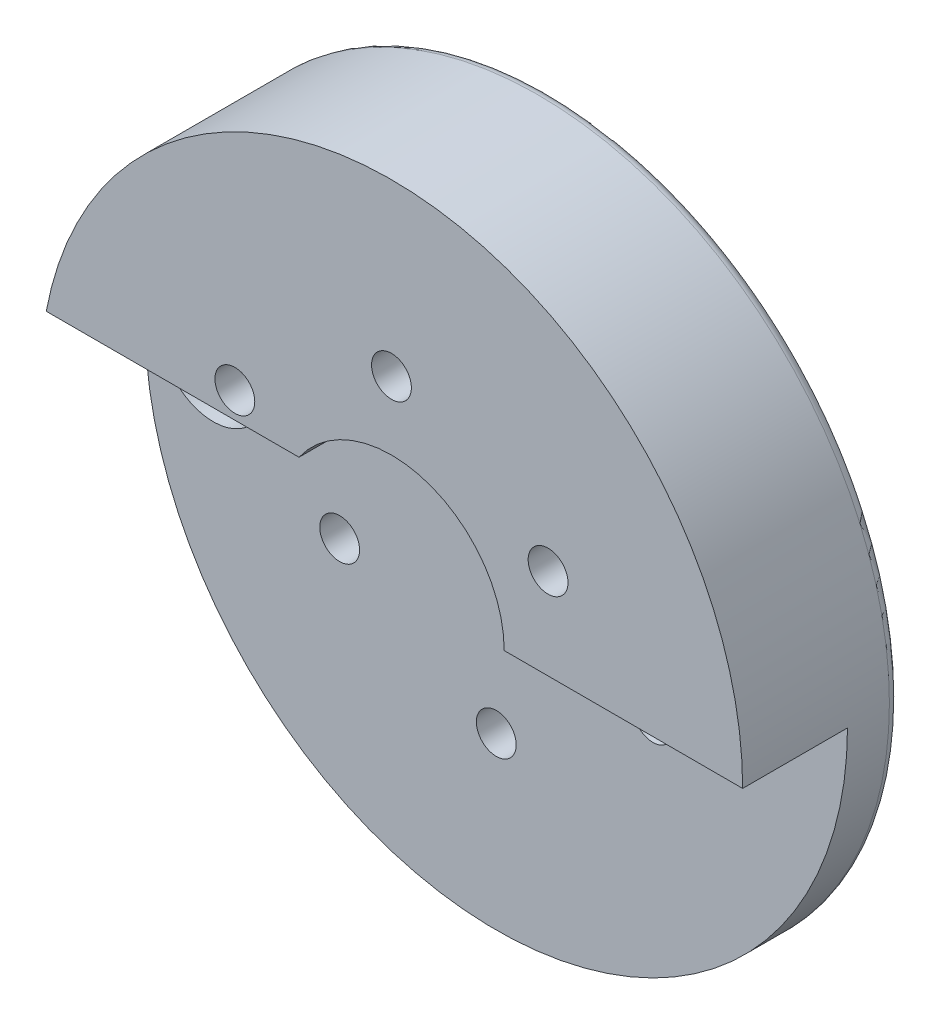
ISO-10303-21;
HEADER;
FILE_DESCRIPTION(('STEP AP214'),'2;1');
FILE_NAME('part.step','',(''),(''),'','','');
FILE_SCHEMA(('AUTOMOTIVE_DESIGN { 1 0 10303 214 1 1 1 1 }'));
ENDSEC;
DATA;
#1=APPLICATION_CONTEXT('core data for automotive mechanical design processes');
#2=APPLICATION_PROTOCOL_DEFINITION('international standard','automotive_design',2000,#1);
#3=PRODUCT_CONTEXT('',#1,'mechanical');
#4=PRODUCT('Part','Part','',(#3));
#5=PRODUCT_RELATED_PRODUCT_CATEGORY('part','',(#4));
#6=PRODUCT_DEFINITION_FORMATION('','',#4);
#7=PRODUCT_DEFINITION_CONTEXT('part definition',#1,'design');
#8=PRODUCT_DEFINITION('design','',#6,#7);
#9=PRODUCT_DEFINITION_SHAPE('','',#8);
#10=(LENGTH_UNIT() NAMED_UNIT(*) SI_UNIT(.MILLI.,.METRE.));
#11=(NAMED_UNIT(*) PLANE_ANGLE_UNIT() SI_UNIT($,.RADIAN.));
#12=(NAMED_UNIT(*) SI_UNIT($,.STERADIAN.) SOLID_ANGLE_UNIT());
#13=UNCERTAINTY_MEASURE_WITH_UNIT(LENGTH_MEASURE(1.E-05),#10,'distance_accuracy_value','');
#14=(GEOMETRIC_REPRESENTATION_CONTEXT(3) GLOBAL_UNCERTAINTY_ASSIGNED_CONTEXT((#13)) GLOBAL_UNIT_ASSIGNED_CONTEXT((#10,
#11,#12)) REPRESENTATION_CONTEXT('',''));
#15=CARTESIAN_POINT('',(0.,0.,0.));
#16=DIRECTION('',(0.,0.,1.));
#17=DIRECTION('',(1.,0.,0.));
#18=AXIS2_PLACEMENT_3D('',#15,#16,#17);
#19=CARTESIAN_POINT('',(14.9389382152816,8.625,-18.));
#20=DIRECTION('',(0.,0.,1.));
#21=DIRECTION('',(-1.,0.,0.));
#22=AXIS2_PLACEMENT_3D('',#19,#20,#21);
#23=CYLINDRICAL_SURFACE('',#22,1.9);
#24=CARTESIAN_POINT('',(14.9389382152816,8.625,0.));
#25=DIRECTION('',(0.,0.,1.));
#26=DIRECTION('',(1.,0.,0.));
#27=AXIS2_PLACEMENT_3D('',#24,#25,#26);
#28=CIRCLE('',#27,1.9);
#29=CARTESIAN_POINT('',(16.8389382152816,8.625,0.));
#30=VERTEX_POINT('',#29);
#31=EDGE_CURVE('E124',#30,#30,#28,.T.);
#32=ORIENTED_EDGE('',*,*,#31,.T.);
#33=EDGE_LOOP('',(#32));
#34=FACE_BOUND('',#33,.T.);
#35=CARTESIAN_POINT('',(14.9389382152816,8.625,-14.));
#36=DIRECTION('',(0.,0.,1.));
#37=DIRECTION('',(1.,0.,0.));
#38=AXIS2_PLACEMENT_3D('',#35,#36,#37);
#39=CIRCLE('',#38,1.9);
#40=CARTESIAN_POINT('',(16.8389382152816,8.625,-14.));
#41=VERTEX_POINT('',#40);
#42=EDGE_CURVE('E140',#41,#41,#39,.T.);
#43=ORIENTED_EDGE('',*,*,#42,.F.);
#44=EDGE_LOOP('',(#43));
#45=FACE_BOUND('',#44,.T.);
#46=ADVANCED_FACE('F43',(#34,#45),#23,.F.);
#47=CARTESIAN_POINT('',(-14.9389382152816,8.62499999999999,-18.));
#48=DIRECTION('',(0.,0.,1.));
#49=DIRECTION('',(-1.,0.,0.));
#50=AXIS2_PLACEMENT_3D('',#47,#48,#49);
#51=CYLINDRICAL_SURFACE('',#50,1.9);
#52=CARTESIAN_POINT('',(-14.9389382152816,8.62499999999999,0.));
#53=DIRECTION('',(0.,0.,1.));
#54=DIRECTION('',(1.,0.,0.));
#55=AXIS2_PLACEMENT_3D('',#52,#53,#54);
#56=CIRCLE('',#55,1.9);
#57=CARTESIAN_POINT('',(-13.0389382152816,8.62499999999999,0.));
#58=VERTEX_POINT('',#57);
#59=EDGE_CURVE('E142',#58,#58,#56,.T.);
#60=ORIENTED_EDGE('',*,*,#59,.T.);
#61=EDGE_LOOP('',(#60));
#62=FACE_BOUND('',#61,.T.);
#63=CARTESIAN_POINT('',(-14.9389382152816,8.62499999999999,-14.));
#64=DIRECTION('',(0.,0.,1.));
#65=DIRECTION('',(1.,0.,0.));
#66=AXIS2_PLACEMENT_3D('',#63,#64,#65);
#67=CIRCLE('',#66,1.9);
#68=CARTESIAN_POINT('',(-13.0389382152816,8.62499999999999,-14.));
#69=VERTEX_POINT('',#68);
#70=EDGE_CURVE('E136',#69,#69,#67,.T.);
#71=ORIENTED_EDGE('',*,*,#70,.F.);
#72=EDGE_LOOP('',(#71));
#73=FACE_BOUND('',#72,.T.);
#74=ADVANCED_FACE('F203',(#62,#73),#51,.F.);
#75=CARTESIAN_POINT('',(0.,17.25,-18.));
#76=DIRECTION('',(0.,0.,1.));
#77=DIRECTION('',(-1.,0.,0.));
#78=AXIS2_PLACEMENT_3D('',#75,#76,#77);
#79=CYLINDRICAL_SURFACE('',#78,1.9);
#80=CARTESIAN_POINT('',(0.,17.25,0.));
#81=DIRECTION('',(0.,0.,1.));
#82=DIRECTION('',(1.,0.,0.));
#83=AXIS2_PLACEMENT_3D('',#80,#81,#82);
#84=CIRCLE('',#83,1.9);
#85=CARTESIAN_POINT('',(1.9,17.25,0.));
#86=VERTEX_POINT('',#85);
#87=EDGE_CURVE('E266',#86,#86,#84,.T.);
#88=ORIENTED_EDGE('',*,*,#87,.T.);
#89=EDGE_LOOP('',(#88));
#90=FACE_BOUND('',#89,.T.);
#91=CARTESIAN_POINT('',(0.,17.25,-14.));
#92=DIRECTION('',(0.,0.,1.));
#93=DIRECTION('',(1.,0.,0.));
#94=AXIS2_PLACEMENT_3D('',#91,#92,#93);
#95=CIRCLE('',#94,1.9);
#96=CARTESIAN_POINT('',(1.9,17.25,-14.));
#97=VERTEX_POINT('',#96);
#98=EDGE_CURVE('E133',#97,#97,#95,.T.);
#99=ORIENTED_EDGE('',*,*,#98,.F.);
#100=EDGE_LOOP('',(#99));
#101=FACE_BOUND('',#100,.T.);
#102=ADVANCED_FACE('F209',(#90,#101),#79,.F.);
#103=CARTESIAN_POINT('',(0.,0.,9.00000000000001));
#104=DIRECTION('',(0.,0.,-1.));
#105=DIRECTION('',(1.,0.,0.));
#106=AXIS2_PLACEMENT_3D('',#103,#104,#105);
#107=CYLINDRICAL_SURFACE('',#106,10.753850496544);
#108=CARTESIAN_POINT('',(0.,0.,-10.));
#109=DIRECTION('',(0.,0.,1.));
#110=DIRECTION('',(1.,0.,0.));
#111=AXIS2_PLACEMENT_3D('',#108,#109,#110);
#112=CIRCLE('',#111,10.753850496544);
#113=CARTESIAN_POINT('',(-8.81639594753669,6.15763452945024,-10.));
#114=VERTEX_POINT('',#113);
#115=CARTESIAN_POINT('',(10.7538147639582,-0.027722274317053,-10.));
#116=VERTEX_POINT('',#115);
#117=EDGE_CURVE('E98',#114,#116,#112,.F.);
#118=ORIENTED_EDGE('',*,*,#117,.T.);
#119=DIRECTION('',(0.,0.,-1.));
#120=VECTOR('',#119,1.);
#121=CARTESIAN_POINT('',(10.7538147639582,-0.027722274317053,9.00000000000001));
#122=LINE('',#121,#120);
#123=CARTESIAN_POINT('',(10.7538147639582,-0.027722274317053,0.));
#124=VERTEX_POINT('',#123);
#125=EDGE_CURVE('E109',#124,#116,#122,.T.);
#126=ORIENTED_EDGE('',*,*,#125,.F.);
#127=CARTESIAN_POINT('',(0.,0.,0.));
#128=DIRECTION('',(0.,0.,1.));
#129=DIRECTION('',(1.,0.,0.));
#130=AXIS2_PLACEMENT_3D('',#127,#128,#129);
#131=CIRCLE('',#130,10.753850496544);
#132=CARTESIAN_POINT('',(-8.81639594753669,6.15763452945024,0.));
#133=VERTEX_POINT('',#132);
#134=EDGE_CURVE('E100',#124,#133,#131,.T.);
#135=ORIENTED_EDGE('',*,*,#134,.T.);
#136=DIRECTION('',(0.,0.,-1.));
#137=VECTOR('',#136,1.);
#138=CARTESIAN_POINT('',(-8.81639594753669,6.15763452945024,9.00000000000001));
#139=LINE('',#138,#137);
#140=EDGE_CURVE('E88',#133,#114,#139,.T.);
#141=ORIENTED_EDGE('',*,*,#140,.T.);
#142=EDGE_LOOP('',(#118,#126,#135,#141));
#143=FACE_BOUND('',#142,.T.);
#144=ADVANCED_FACE('F96',(#143),#107,.F.);
#145=CARTESIAN_POINT('',(10.7538147639582,-0.027722274317053,9.00000000000001));
#146=DIRECTION('',(0.000734290482079593,0.999999730408708,0.));
#147=DIRECTION('',(-0.999999730408708,0.000734290482079593,0.));
#148=AXIS2_PLACEMENT_3D('',#145,#146,#147);
#149=PLANE('',#148);
#150=DIRECTION('',(0.999999730408708,-0.000734290482079593,0.));
#151=VECTOR('',#150,1.);
#152=CARTESIAN_POINT('',(10.7538147639582,-0.027722274317053,-10.));
#153=LINE('',#152,#151);
#154=CARTESIAN_POINT('',(33.4999705441373,-0.0444245645131287,-10.));
#155=VERTEX_POINT('',#154);
#156=EDGE_CURVE('E58',#116,#155,#153,.T.);
#157=ORIENTED_EDGE('',*,*,#156,.T.);
#158=DIRECTION('',(0.,0.,-1.));
#159=VECTOR('',#158,1.);
#160=CARTESIAN_POINT('',(33.4999705441373,-0.0444245645131287,9.00000000000001));
#161=LINE('',#160,#159);
#162=CARTESIAN_POINT('',(33.4999705441373,-0.0444245645131287,0.));
#163=VERTEX_POINT('',#162);
#164=EDGE_CURVE('E112',#163,#155,#161,.T.);
#165=ORIENTED_EDGE('',*,*,#164,.F.);
#166=DIRECTION('',(-0.999999730408708,0.000734290482079593,0.));
#167=VECTOR('',#166,1.);
#168=CARTESIAN_POINT('',(-1.45579278259614E-05,-0.0198258376712731,0.));
#169=LINE('',#168,#167);
#170=EDGE_CURVE('E92',#163,#124,#169,.T.);
#171=ORIENTED_EDGE('',*,*,#170,.T.);
#172=ORIENTED_EDGE('',*,*,#125,.T.);
#173=EDGE_LOOP('',(#157,#165,#171,#172));
#174=FACE_BOUND('',#173,.T.);
#175=ADVANCED_FACE('F281',(#174),#149,.F.);
#176=CARTESIAN_POINT('',(-8.81639594753669,6.15763452945024,9.00000000000001));
#177=DIRECTION('',(0.,1.,0.));
#178=DIRECTION('',(-1.,0.,0.));
#179=AXIS2_PLACEMENT_3D('',#176,#177,#178);
#180=PLANE('',#179);
#181=DIRECTION('',(1.,0.,0.));
#182=VECTOR('',#181,1.);
#183=CARTESIAN_POINT('',(-8.81639594753669,6.15763452945024,-10.));
#184=LINE('',#183,#182);
#185=CARTESIAN_POINT('',(-32.929220109224,6.15763452945023,-10.));
#186=VERTEX_POINT('',#185);
#187=EDGE_CURVE('E84',#186,#114,#184,.T.);
#188=ORIENTED_EDGE('',*,*,#187,.T.);
#189=ORIENTED_EDGE('',*,*,#140,.F.);
#190=DIRECTION('',(-1.,0.,0.));
#191=VECTOR('',#190,1.);
#192=CARTESIAN_POINT('',(0.,6.15763452945024,0.));
#193=LINE('',#192,#191);
#194=CARTESIAN_POINT('',(-32.929220109224,6.15763452945023,0.));
#195=VERTEX_POINT('',#194);
#196=EDGE_CURVE('E116',#133,#195,#193,.T.);
#197=ORIENTED_EDGE('',*,*,#196,.T.);
#198=DIRECTION('',(0.,0.,-1.));
#199=VECTOR('',#198,1.);
#200=CARTESIAN_POINT('',(-32.929220109224,6.15763452945023,9.00000000000001));
#201=LINE('',#200,#199);
#202=EDGE_CURVE('E91',#195,#186,#201,.T.);
#203=ORIENTED_EDGE('',*,*,#202,.T.);
#204=EDGE_LOOP('',(#188,#189,#197,#203));
#205=FACE_BOUND('',#204,.T.);
#206=ADVANCED_FACE('F86',(#205),#180,.F.);
#207=CARTESIAN_POINT('',(0.,0.,-13.));
#208=DIRECTION('',(0.,0.,1.));
#209=DIRECTION('',(-1.,0.,0.));
#210=AXIS2_PLACEMENT_3D('',#207,#208,#209);
#211=CYLINDRICAL_SURFACE('',#210,33.5);
#212=CARTESIAN_POINT('',(0.,0.,-14.));
#213=DIRECTION('',(0.,0.,1.));
#214=DIRECTION('',(1.,0.,0.));
#215=AXIS2_PLACEMENT_3D('',#212,#213,#214);
#216=CIRCLE('',#215,33.5);
#217=CARTESIAN_POINT('',(33.5,0.,-14.));
#218=VERTEX_POINT('',#217);
#219=EDGE_CURVE('E11',#218,#218,#216,.F.);
#220=ORIENTED_EDGE('',*,*,#219,.F.);
#221=EDGE_LOOP('',(#220));
#222=FACE_BOUND('',#221,.T.);
#223=CARTESIAN_POINT('',(1.62370117351429E-12,2.99760216648792E-12,-10.));
#224=DIRECTION('',(0.,0.,1.));
#225=DIRECTION('',(1.,0.,0.));
#226=AXIS2_PLACEMENT_3D('',#223,#224,#225);
#227=CIRCLE('',#226,33.5);
#228=EDGE_CURVE('E63',#186,#155,#227,.T.);
#229=ORIENTED_EDGE('',*,*,#228,.F.);
#230=ORIENTED_EDGE('',*,*,#202,.F.);
#231=CARTESIAN_POINT('',(0.,0.,0.));
#232=DIRECTION('',(0.,0.,1.));
#233=DIRECTION('',(1.,0.,0.));
#234=AXIS2_PLACEMENT_3D('',#231,#232,#233);
#235=CIRCLE('',#234,33.5);
#236=EDGE_CURVE('E111',#163,#195,#235,.T.);
#237=ORIENTED_EDGE('',*,*,#236,.F.);
#238=ORIENTED_EDGE('',*,*,#164,.T.);
#239=EDGE_LOOP('',(#229,#230,#237,#238));
#240=FACE_BOUND('',#239,.T.);
#241=ADVANCED_FACE('F274',(#222,#240),#211,.T.);
#242=CARTESIAN_POINT('',(0.,0.,0.));
#243=DIRECTION('',(0.,0.,-1.));
#244=DIRECTION('',(1.,0.,0.));
#245=AXIS2_PLACEMENT_3D('',#242,#243,#244);
#246=PLANE('',#245);
#247=ORIENTED_EDGE('',*,*,#87,.F.);
#248=EDGE_LOOP('',(#247));
#249=FACE_BOUND('',#248,.T.);
#250=ORIENTED_EDGE('',*,*,#59,.F.);
#251=EDGE_LOOP('',(#250));
#252=FACE_BOUND('',#251,.T.);
#253=ORIENTED_EDGE('',*,*,#31,.F.);
#254=EDGE_LOOP('',(#253));
#255=FACE_BOUND('',#254,.T.);
#256=ORIENTED_EDGE('',*,*,#236,.T.);
#257=ORIENTED_EDGE('',*,*,#196,.F.);
#258=ORIENTED_EDGE('',*,*,#134,.F.);
#259=ORIENTED_EDGE('',*,*,#170,.F.);
#260=EDGE_LOOP('',(#256,#257,#258,#259));
#261=FACE_BOUND('',#260,.T.);
#262=ADVANCED_FACE('F271',(#249,#252,#255,#261),#246,.F.);
#263=CARTESIAN_POINT('',(1.62370117351429E-12,2.99760216648792E-12,-10.));
#264=DIRECTION('',(0.,0.,-1.));
#265=DIRECTION('',(1.,0.,0.));
#266=AXIS2_PLACEMENT_3D('',#263,#264,#265);
#267=PLANE('',#266);
#268=CARTESIAN_POINT('',(-14.9389382152816,-8.62500000000001,-10.));
#269=DIRECTION('',(0.,0.,1.));
#270=DIRECTION('',(1.,0.,0.));
#271=AXIS2_PLACEMENT_3D('',#268,#269,#270);
#272=CIRCLE('',#271,1.9);
#273=CARTESIAN_POINT('',(-13.0389382152816,-8.62500000000001,-10.));
#274=VERTEX_POINT('',#273);
#275=EDGE_CURVE('E132',#274,#274,#272,.F.);
#276=ORIENTED_EDGE('',*,*,#275,.T.);
#277=EDGE_LOOP('',(#276));
#278=FACE_BOUND('',#277,.T.);
#279=CARTESIAN_POINT('',(0.,-17.25,-10.));
#280=DIRECTION('',(0.,0.,1.));
#281=DIRECTION('',(1.,0.,0.));
#282=AXIS2_PLACEMENT_3D('',#279,#280,#281);
#283=CIRCLE('',#282,1.9);
#284=CARTESIAN_POINT('',(1.9,-17.25,-10.));
#285=VERTEX_POINT('',#284);
#286=EDGE_CURVE('E128',#285,#285,#283,.F.);
#287=ORIENTED_EDGE('',*,*,#286,.T.);
#288=EDGE_LOOP('',(#287));
#289=FACE_BOUND('',#288,.T.);
#290=CARTESIAN_POINT('',(14.9389382152816,-8.625,-10.));
#291=DIRECTION('',(0.,0.,1.));
#292=DIRECTION('',(1.,0.,0.));
#293=AXIS2_PLACEMENT_3D('',#290,#291,#292);
#294=CIRCLE('',#293,1.9);
#295=CARTESIAN_POINT('',(16.8389382152816,-8.625,-10.));
#296=VERTEX_POINT('',#295);
#297=EDGE_CURVE('E123',#296,#296,#294,.F.);
#298=ORIENTED_EDGE('',*,*,#297,.T.);
#299=EDGE_LOOP('',(#298));
#300=FACE_BOUND('',#299,.T.);
#301=CARTESIAN_POINT('',(-27.,0.,-10.));
#302=DIRECTION('',(0.,0.,-1.));
#303=DIRECTION('',(-1.,0.,0.));
#304=AXIS2_PLACEMENT_3D('',#301,#302,#303);
#305=CIRCLE('',#304,4.99999999999627);
#306=CARTESIAN_POINT('',(-31.9999999999963,0.,-10.));
#307=VERTEX_POINT('',#306);
#308=EDGE_CURVE('E187',#307,#307,#305,.T.);
#309=ORIENTED_EDGE('',*,*,#308,.T.);
#310=EDGE_LOOP('',(#309));
#311=FACE_BOUND('',#310,.T.);
#312=ORIENTED_EDGE('',*,*,#117,.F.);
#313=ORIENTED_EDGE('',*,*,#187,.F.);
#314=ORIENTED_EDGE('',*,*,#228,.T.);
#315=ORIENTED_EDGE('',*,*,#156,.F.);
#316=EDGE_LOOP('',(#312,#313,#314,#315));
#317=FACE_BOUND('',#316,.T.);
#318=ADVANCED_FACE('F102',(#278,#289,#300,#311,#317),#267,.F.);
#319=CARTESIAN_POINT('',(1.62370117351429E-12,2.99760216648792E-12,-15.));
#320=DIRECTION('',(0.,0.,-1.));
#321=DIRECTION('',(1.,0.,0.));
#322=AXIS2_PLACEMENT_3D('',#319,#320,#321);
#323=PLANE('',#322);
#324=CARTESIAN_POINT('',(0.,0.,-15.));
#325=DIRECTION('',(0.,0.,1.));
#326=DIRECTION('',(1.,0.,0.));
#327=AXIS2_PLACEMENT_3D('',#324,#325,#326);
#328=CIRCLE('',#327,32.5);
#329=CARTESIAN_POINT('',(32.5,0.,-15.));
#330=VERTEX_POINT('',#329);
#331=EDGE_CURVE('E51',#330,#330,#328,.T.);
#332=ORIENTED_EDGE('',*,*,#331,.F.);
#333=EDGE_LOOP('',(#332));
#334=FACE_BOUND('',#333,.T.);
#335=CARTESIAN_POINT('',(14.9389382152816,8.625,-15.));
#336=DIRECTION('',(0.,0.,1.));
#337=DIRECTION('',(1.,0.,0.));
#338=AXIS2_PLACEMENT_3D('',#335,#336,#337);
#339=CIRCLE('',#338,4.5);
#340=CARTESIAN_POINT('',(19.4389382152816,8.625,-15.));
#341=VERTEX_POINT('',#340);
#342=EDGE_CURVE('E155',#341,#341,#339,.T.);
#343=ORIENTED_EDGE('',*,*,#342,.T.);
#344=EDGE_LOOP('',(#343));
#345=FACE_BOUND('',#344,.T.);
#346=CARTESIAN_POINT('',(-14.9389382152816,8.62499999999999,-15.));
#347=DIRECTION('',(0.,0.,1.));
#348=DIRECTION('',(1.,0.,0.));
#349=AXIS2_PLACEMENT_3D('',#346,#347,#348);
#350=CIRCLE('',#349,4.5);
#351=CARTESIAN_POINT('',(-10.4389382152816,8.62499999999999,-15.));
#352=VERTEX_POINT('',#351);
#353=EDGE_CURVE('E159',#352,#352,#350,.T.);
#354=ORIENTED_EDGE('',*,*,#353,.T.);
#355=EDGE_LOOP('',(#354));
#356=FACE_BOUND('',#355,.T.);
#357=CARTESIAN_POINT('',(0.,17.25,-15.));
#358=DIRECTION('',(0.,0.,1.));
#359=DIRECTION('',(1.,0.,0.));
#360=AXIS2_PLACEMENT_3D('',#357,#358,#359);
#361=CIRCLE('',#360,4.5);
#362=CARTESIAN_POINT('',(4.5,17.25,-15.));
#363=VERTEX_POINT('',#362);
#364=EDGE_CURVE('E163',#363,#363,#361,.T.);
#365=ORIENTED_EDGE('',*,*,#364,.T.);
#366=EDGE_LOOP('',(#365));
#367=FACE_BOUND('',#366,.T.);
#368=CARTESIAN_POINT('',(-14.9389382152816,-8.62500000000001,-15.));
#369=DIRECTION('',(0.,0.,1.));
#370=DIRECTION('',(1.,0.,0.));
#371=AXIS2_PLACEMENT_3D('',#368,#369,#370);
#372=CIRCLE('',#371,1.9);
#373=CARTESIAN_POINT('',(-13.0389382152816,-8.62500000000001,-15.));
#374=VERTEX_POINT('',#373);
#375=EDGE_CURVE('E129',#374,#374,#372,.F.);
#376=ORIENTED_EDGE('',*,*,#375,.F.);
#377=EDGE_LOOP('',(#376));
#378=FACE_BOUND('',#377,.T.);
#379=CARTESIAN_POINT('',(0.,-17.25,-15.));
#380=DIRECTION('',(0.,0.,1.));
#381=DIRECTION('',(1.,0.,0.));
#382=AXIS2_PLACEMENT_3D('',#379,#380,#381);
#383=CIRCLE('',#382,1.9);
#384=CARTESIAN_POINT('',(1.9,-17.25,-15.));
#385=VERTEX_POINT('',#384);
#386=EDGE_CURVE('E125',#385,#385,#383,.F.);
#387=ORIENTED_EDGE('',*,*,#386,.F.);
#388=EDGE_LOOP('',(#387));
#389=FACE_BOUND('',#388,.T.);
#390=CARTESIAN_POINT('',(14.9389382152816,-8.625,-15.));
#391=DIRECTION('',(0.,0.,1.));
#392=DIRECTION('',(1.,0.,0.));
#393=AXIS2_PLACEMENT_3D('',#390,#391,#392);
#394=CIRCLE('',#393,1.9);
#395=CARTESIAN_POINT('',(16.8389382152816,-8.625,-15.));
#396=VERTEX_POINT('',#395);
#397=EDGE_CURVE('E120',#396,#396,#394,.F.);
#398=ORIENTED_EDGE('',*,*,#397,.F.);
#399=EDGE_LOOP('',(#398));
#400=FACE_BOUND('',#399,.T.);
#401=ADVANCED_FACE('F147',(#334,#345,#356,#367,#378,#389,#400),#323,.T.);
#402=CARTESIAN_POINT('',(-27.,0.,-12.5));
#403=DIRECTION('',(0.,0.,1.));
#404=DIRECTION('',(-1.,0.,0.));
#405=AXIS2_PLACEMENT_3D('',#402,#403,#404);
#406=CYLINDRICAL_SURFACE('',#405,4.99999999999627);
#407=CARTESIAN_POINT('',(-27.,0.,-12.5));
#408=DIRECTION('',(0.,0.,-1.));
#409=DIRECTION('',(-1.,0.,0.));
#410=AXIS2_PLACEMENT_3D('',#407,#408,#409);
#411=CIRCLE('',#410,4.99999999999627);
#412=CARTESIAN_POINT('',(-31.9999999999963,0.,-12.5));
#413=VERTEX_POINT('',#412);
#414=EDGE_CURVE('E105',#413,#413,#411,.T.);
#415=ORIENTED_EDGE('',*,*,#414,.T.);
#416=EDGE_LOOP('',(#415));
#417=FACE_BOUND('',#416,.T.);
#418=ORIENTED_EDGE('',*,*,#308,.F.);
#419=EDGE_LOOP('',(#418));
#420=FACE_BOUND('',#419,.T.);
#421=ADVANCED_FACE('F150',(#417,#420),#406,.F.);
#422=CARTESIAN_POINT('',(-27.,0.,-12.5));
#423=DIRECTION('',(0.,0.,1.));
#424=DIRECTION('',(-1.,0.,0.));
#425=AXIS2_PLACEMENT_3D('',#422,#423,#424);
#426=PLANE('',#425);
#427=ORIENTED_EDGE('',*,*,#414,.F.);
#428=EDGE_LOOP('',(#427));
#429=FACE_BOUND('',#428,.T.);
#430=ADVANCED_FACE('F174',(#429),#426,.T.);
#431=CARTESIAN_POINT('',(14.9389382152816,-8.625,-18.));
#432=DIRECTION('',(0.,0.,1.));
#433=DIRECTION('',(-1.,0.,0.));
#434=AXIS2_PLACEMENT_3D('',#431,#432,#433);
#435=CYLINDRICAL_SURFACE('',#434,1.9);
#436=ORIENTED_EDGE('',*,*,#397,.T.);
#437=EDGE_LOOP('',(#436));
#438=FACE_BOUND('',#437,.T.);
#439=ORIENTED_EDGE('',*,*,#297,.F.);
#440=EDGE_LOOP('',(#439));
#441=FACE_BOUND('',#440,.T.);
#442=ADVANCED_FACE('F170',(#438,#441),#435,.F.);
#443=CARTESIAN_POINT('',(0.,-17.25,-18.));
#444=DIRECTION('',(0.,0.,1.));
#445=DIRECTION('',(-1.,0.,0.));
#446=AXIS2_PLACEMENT_3D('',#443,#444,#445);
#447=CYLINDRICAL_SURFACE('',#446,1.9);
#448=ORIENTED_EDGE('',*,*,#386,.T.);
#449=EDGE_LOOP('',(#448));
#450=FACE_BOUND('',#449,.T.);
#451=ORIENTED_EDGE('',*,*,#286,.F.);
#452=EDGE_LOOP('',(#451));
#453=FACE_BOUND('',#452,.T.);
#454=ADVANCED_FACE('F173',(#450,#453),#447,.F.);
#455=CARTESIAN_POINT('',(-14.9389382152816,-8.62500000000001,-18.));
#456=DIRECTION('',(0.,0.,1.));
#457=DIRECTION('',(-1.,0.,0.));
#458=AXIS2_PLACEMENT_3D('',#455,#456,#457);
#459=CYLINDRICAL_SURFACE('',#458,1.9);
#460=ORIENTED_EDGE('',*,*,#375,.T.);
#461=EDGE_LOOP('',(#460));
#462=FACE_BOUND('',#461,.T.);
#463=ORIENTED_EDGE('',*,*,#275,.F.);
#464=EDGE_LOOP('',(#463));
#465=FACE_BOUND('',#464,.T.);
#466=ADVANCED_FACE('F218',(#462,#465),#459,.F.);
#467=CARTESIAN_POINT('',(0.,17.25,-14.));
#468=DIRECTION('',(0.,0.,-1.));
#469=DIRECTION('',(1.,0.,0.));
#470=AXIS2_PLACEMENT_3D('',#467,#468,#469);
#471=CYLINDRICAL_SURFACE('',#470,4.5);
#472=CARTESIAN_POINT('',(0.,17.25,-14.));
#473=DIRECTION('',(0.,0.,1.));
#474=DIRECTION('',(1.,0.,0.));
#475=AXIS2_PLACEMENT_3D('',#472,#473,#474);
#476=CIRCLE('',#475,4.5);
#477=CARTESIAN_POINT('',(4.5,17.25,-14.));
#478=VERTEX_POINT('',#477);
#479=EDGE_CURVE('E137',#478,#478,#476,.T.);
#480=ORIENTED_EDGE('',*,*,#479,.T.);
#481=EDGE_LOOP('',(#480));
#482=FACE_BOUND('',#481,.T.);
#483=ORIENTED_EDGE('',*,*,#364,.F.);
#484=EDGE_LOOP('',(#483));
#485=FACE_BOUND('',#484,.T.);
#486=ADVANCED_FACE('F221',(#482,#485),#471,.F.);
#487=CARTESIAN_POINT('',(0.,17.25,-14.));
#488=DIRECTION('',(0.,0.,-1.));
#489=DIRECTION('',(1.,0.,0.));
#490=AXIS2_PLACEMENT_3D('',#487,#488,#489);
#491=PLANE('',#490);
#492=ORIENTED_EDGE('',*,*,#98,.T.);
#493=EDGE_LOOP('',(#492));
#494=FACE_BOUND('',#493,.T.);
#495=ORIENTED_EDGE('',*,*,#479,.F.);
#496=EDGE_LOOP('',(#495));
#497=FACE_BOUND('',#496,.T.);
#498=ADVANCED_FACE('F228',(#494,#497),#491,.T.);
#499=CARTESIAN_POINT('',(-14.9389382152816,8.62499999999999,-14.));
#500=DIRECTION('',(0.,0.,-1.));
#501=DIRECTION('',(1.,0.,0.));
#502=AXIS2_PLACEMENT_3D('',#499,#500,#501);
#503=CYLINDRICAL_SURFACE('',#502,4.5);
#504=CARTESIAN_POINT('',(-14.9389382152816,8.62499999999999,-14.));
#505=DIRECTION('',(0.,0.,1.));
#506=DIRECTION('',(1.,0.,0.));
#507=AXIS2_PLACEMENT_3D('',#504,#505,#506);
#508=CIRCLE('',#507,4.5);
#509=CARTESIAN_POINT('',(-10.4389382152816,8.62499999999999,-14.));
#510=VERTEX_POINT('',#509);
#511=EDGE_CURVE('E254',#510,#510,#508,.T.);
#512=ORIENTED_EDGE('',*,*,#511,.T.);
#513=EDGE_LOOP('',(#512));
#514=FACE_BOUND('',#513,.T.);
#515=ORIENTED_EDGE('',*,*,#353,.F.);
#516=EDGE_LOOP('',(#515));
#517=FACE_BOUND('',#516,.T.);
#518=ADVANCED_FACE('F232',(#514,#517),#503,.F.);
#519=CARTESIAN_POINT('',(-14.9389382152816,8.62499999999999,-14.));
#520=DIRECTION('',(0.,0.,-1.));
#521=DIRECTION('',(1.,0.,0.));
#522=AXIS2_PLACEMENT_3D('',#519,#520,#521);
#523=PLANE('',#522);
#524=ORIENTED_EDGE('',*,*,#70,.T.);
#525=EDGE_LOOP('',(#524));
#526=FACE_BOUND('',#525,.T.);
#527=ORIENTED_EDGE('',*,*,#511,.F.);
#528=EDGE_LOOP('',(#527));
#529=FACE_BOUND('',#528,.T.);
#530=ADVANCED_FACE('F238',(#526,#529),#523,.T.);
#531=CARTESIAN_POINT('',(14.9389382152816,8.625,-14.));
#532=DIRECTION('',(0.,0.,-1.));
#533=DIRECTION('',(1.,0.,0.));
#534=AXIS2_PLACEMENT_3D('',#531,#532,#533);
#535=CYLINDRICAL_SURFACE('',#534,4.5);
#536=CARTESIAN_POINT('',(14.9389382152816,8.625,-14.));
#537=DIRECTION('',(0.,0.,1.));
#538=DIRECTION('',(1.,0.,0.));
#539=AXIS2_PLACEMENT_3D('',#536,#537,#538);
#540=CIRCLE('',#539,4.5);
#541=CARTESIAN_POINT('',(19.4389382152816,8.625,-14.));
#542=VERTEX_POINT('',#541);
#543=EDGE_CURVE('E257',#542,#542,#540,.T.);
#544=ORIENTED_EDGE('',*,*,#543,.T.);
#545=EDGE_LOOP('',(#544));
#546=FACE_BOUND('',#545,.T.);
#547=ORIENTED_EDGE('',*,*,#342,.F.);
#548=EDGE_LOOP('',(#547));
#549=FACE_BOUND('',#548,.T.);
#550=ADVANCED_FACE('F234',(#546,#549),#535,.F.);
#551=CARTESIAN_POINT('',(14.9389382152816,8.625,-14.));
#552=DIRECTION('',(0.,0.,-1.));
#553=DIRECTION('',(1.,0.,0.));
#554=AXIS2_PLACEMENT_3D('',#551,#552,#553);
#555=PLANE('',#554);
#556=ORIENTED_EDGE('',*,*,#42,.T.);
#557=EDGE_LOOP('',(#556));
#558=FACE_BOUND('',#557,.T.);
#559=ORIENTED_EDGE('',*,*,#543,.F.);
#560=EDGE_LOOP('',(#559));
#561=FACE_BOUND('',#560,.T.);
#562=ADVANCED_FACE('F237',(#558,#561),#555,.T.);
#563=CARTESIAN_POINT('',(0.,0.,-14.));
#564=DIRECTION('',(0.,0.,-1.));
#565=DIRECTION('',(1.,0.,0.));
#566=AXIS2_PLACEMENT_3D('',#563,#564,#565);
#567=TOROIDAL_SURFACE('',#566,32.5,1.);
#568=ORIENTED_EDGE('',*,*,#219,.T.);
#569=EDGE_LOOP('',(#568));
#570=FACE_BOUND('',#569,.T.);
#571=ORIENTED_EDGE('',*,*,#331,.T.);
#572=EDGE_LOOP('',(#571));
#573=FACE_BOUND('',#572,.T.);
#574=ADVANCED_FACE('F45',(#570,#573),#567,.T.);
#575=CLOSED_SHELL('',(#46,#74,#102,#144,#175,#206,#241,#262,#318,#401,#421,#430,#442,#454,#466,
#486,#498,#518,#530,#550,#562,#574));
#576=MANIFOLD_SOLID_BREP('B2',#575);
#577=ADVANCED_BREP_SHAPE_REPRESENTATION('',(#18,#576),#14);
#578=SHAPE_DEFINITION_REPRESENTATION(#9,#577);
ENDSEC;
END-ISO-10303-21;
